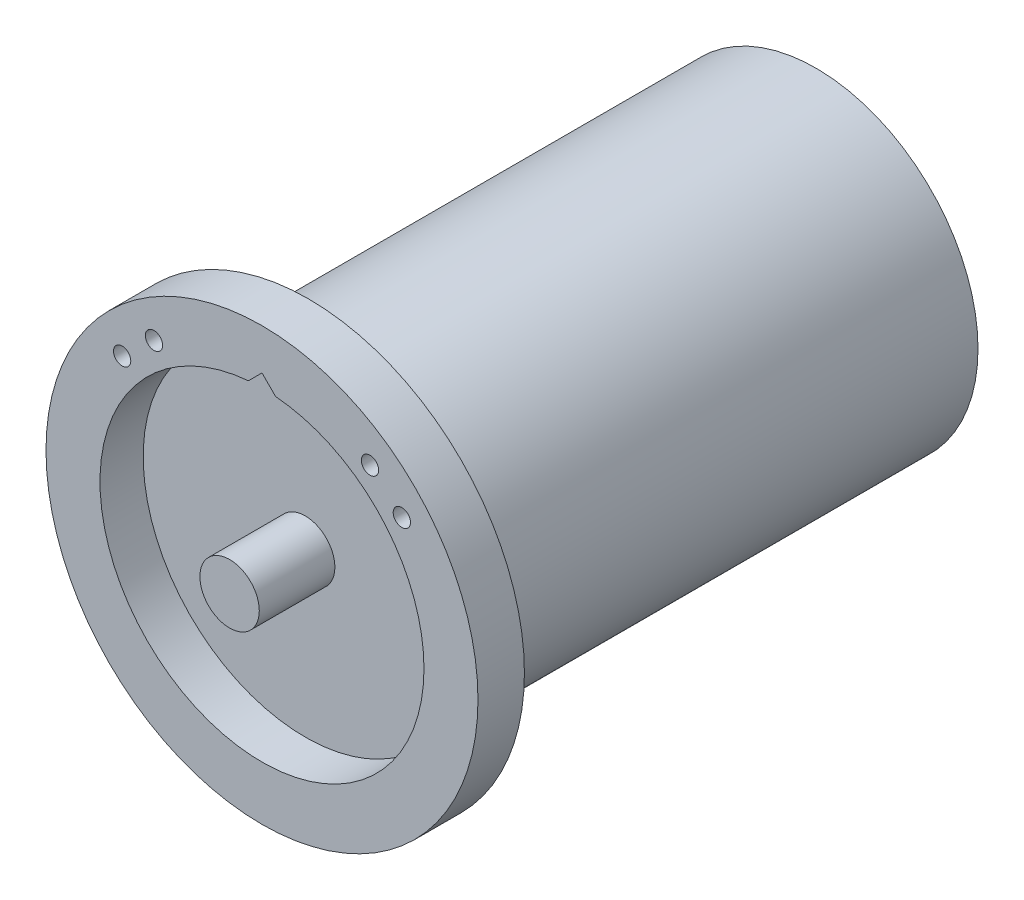
ISO-10303-21;
HEADER;
FILE_DESCRIPTION(('STEP AP214'),'2;1');
FILE_NAME('part.step','',(''),(''),'','','');
FILE_SCHEMA(('AUTOMOTIVE_DESIGN { 1 0 10303 214 1 1 1 1 }'));
ENDSEC;
DATA;
#1=APPLICATION_CONTEXT('core data for automotive mechanical design processes');
#2=APPLICATION_PROTOCOL_DEFINITION('international standard','automotive_design',2000,#1);
#3=PRODUCT_CONTEXT('',#1,'mechanical');
#4=PRODUCT('Part','Part','',(#3));
#5=PRODUCT_RELATED_PRODUCT_CATEGORY('part','',(#4));
#6=PRODUCT_DEFINITION_FORMATION('','',#4);
#7=PRODUCT_DEFINITION_CONTEXT('part definition',#1,'design');
#8=PRODUCT_DEFINITION('design','',#6,#7);
#9=PRODUCT_DEFINITION_SHAPE('','',#8);
#10=(LENGTH_UNIT() NAMED_UNIT(*) SI_UNIT(.MILLI.,.METRE.));
#11=(NAMED_UNIT(*) PLANE_ANGLE_UNIT() SI_UNIT($,.RADIAN.));
#12=(NAMED_UNIT(*) SI_UNIT($,.STERADIAN.) SOLID_ANGLE_UNIT());
#13=UNCERTAINTY_MEASURE_WITH_UNIT(LENGTH_MEASURE(1.E-05),#10,'distance_accuracy_value','');
#14=(GEOMETRIC_REPRESENTATION_CONTEXT(3) GLOBAL_UNCERTAINTY_ASSIGNED_CONTEXT((#13)) GLOBAL_UNIT_ASSIGNED_CONTEXT((#10,
#11,#12)) REPRESENTATION_CONTEXT('',''));
#15=CARTESIAN_POINT('',(0.,0.,0.));
#16=DIRECTION('',(0.,0.,1.));
#17=DIRECTION('',(1.,0.,0.));
#18=AXIS2_PLACEMENT_3D('',#15,#16,#17);
#19=CARTESIAN_POINT('',(0.,0.,2.));
#20=DIRECTION('',(0.,0.,-1.));
#21=DIRECTION('',(-1.,0.,0.));
#22=AXIS2_PLACEMENT_3D('',#19,#20,#21);
#23=CYLINDRICAL_SURFACE('',#22,15.5);
#24=CARTESIAN_POINT('',(0.,0.,2.));
#25=DIRECTION('',(0.,0.,1.));
#26=DIRECTION('',(1.,0.,0.));
#27=AXIS2_PLACEMENT_3D('',#24,#25,#26);
#28=CIRCLE('',#27,15.5);
#29=CARTESIAN_POINT('',(15.5,0.,2.));
#30=VERTEX_POINT('',#29);
#31=EDGE_CURVE('E131',#30,#30,#28,.T.);
#32=ORIENTED_EDGE('',*,*,#31,.F.);
#33=EDGE_LOOP('',(#32));
#34=FACE_BOUND('',#33,.T.);
#35=CARTESIAN_POINT('',(0.,0.,0.));
#36=DIRECTION('',(0.,0.,1.));
#37=DIRECTION('',(1.,0.,0.));
#38=AXIS2_PLACEMENT_3D('',#35,#36,#37);
#39=CIRCLE('',#38,15.5);
#40=CARTESIAN_POINT('',(15.5,0.,0.));
#41=VERTEX_POINT('',#40);
#42=EDGE_CURVE('E127',#41,#41,#39,.T.);
#43=ORIENTED_EDGE('',*,*,#42,.T.);
#44=EDGE_LOOP('',(#43));
#45=FACE_BOUND('',#44,.T.);
#46=ADVANCED_FACE('F40',(#34,#45),#23,.T.);
#47=CARTESIAN_POINT('',(0.,0.,0.));
#48=DIRECTION('',(0.,0.,1.));
#49=DIRECTION('',(1.,0.,0.));
#50=AXIS2_PLACEMENT_3D('',#47,#48,#49);
#51=PLANE('',#50);
#52=CARTESIAN_POINT('',(0.,0.,0.));
#53=DIRECTION('',(0.,0.,-1.));
#54=DIRECTION('',(-1.,0.,0.));
#55=AXIS2_PLACEMENT_3D('',#52,#53,#54);
#56=CIRCLE('',#55,15.);
#57=CARTESIAN_POINT('',(15.,0.,0.));
#58=VERTEX_POINT('',#57);
#59=EDGE_CURVE('E128',#58,#58,#56,.T.);
#60=ORIENTED_EDGE('',*,*,#59,.F.);
#61=EDGE_LOOP('',(#60));
#62=FACE_BOUND('',#61,.T.);
#63=ORIENTED_EDGE('',*,*,#42,.F.);
#64=EDGE_LOOP('',(#63));
#65=FACE_BOUND('',#64,.T.);
#66=ADVANCED_FACE('F183',(#62,#65),#51,.F.);
#67=CARTESIAN_POINT('',(0.,0.,-45.));
#68=DIRECTION('',(0.,0.,1.));
#69=DIRECTION('',(1.,0.,0.));
#70=AXIS2_PLACEMENT_3D('',#67,#68,#69);
#71=CYLINDRICAL_SURFACE('',#70,15.);
#72=CARTESIAN_POINT('',(0.,0.,-45.));
#73=DIRECTION('',(0.,0.,-1.));
#74=DIRECTION('',(-1.,0.,0.));
#75=AXIS2_PLACEMENT_3D('',#72,#73,#74);
#76=CIRCLE('',#75,15.);
#77=CARTESIAN_POINT('',(15.,0.,-45.));
#78=VERTEX_POINT('',#77);
#79=EDGE_CURVE('E122',#78,#78,#76,.T.);
#80=CARTESIAN_POINT('',(15.,0.,-45.));
#81=CARTESIAN_POINT('',(15.,0.,-44.53125));
#82=CARTESIAN_POINT('',(15.,0.,-44.0625));
#83=CARTESIAN_POINT('',(15.,0.,-43.125));
#84=CARTESIAN_POINT('',(15.,0.,-42.65625));
#85=CARTESIAN_POINT('',(15.,0.,-41.71875));
#86=CARTESIAN_POINT('',(15.,0.,-41.25));
#87=CARTESIAN_POINT('',(15.,0.,-40.3125));
#88=CARTESIAN_POINT('',(15.,0.,-39.84375));
#89=CARTESIAN_POINT('',(15.,0.,-38.90625));
#90=CARTESIAN_POINT('',(15.,0.,-38.4375));
#91=CARTESIAN_POINT('',(15.,0.,-37.5));
#92=CARTESIAN_POINT('',(15.,0.,-37.03125));
#93=CARTESIAN_POINT('',(15.,0.,-36.09375));
#94=CARTESIAN_POINT('',(15.,0.,-35.625));
#95=CARTESIAN_POINT('',(15.,0.,-34.6875));
#96=CARTESIAN_POINT('',(15.,0.,-34.21875));
#97=CARTESIAN_POINT('',(15.,0.,-33.28125));
#98=CARTESIAN_POINT('',(15.,0.,-32.8125));
#99=CARTESIAN_POINT('',(15.,0.,-31.875));
#100=CARTESIAN_POINT('',(15.,0.,-31.40625));
#101=CARTESIAN_POINT('',(15.,0.,-30.46875));
#102=CARTESIAN_POINT('',(15.,0.,-30.));
#103=CARTESIAN_POINT('',(15.,0.,-29.0625));
#104=CARTESIAN_POINT('',(15.,0.,-28.59375));
#105=CARTESIAN_POINT('',(15.,0.,-27.65625));
#106=CARTESIAN_POINT('',(15.,0.,-27.1875));
#107=CARTESIAN_POINT('',(15.,0.,-26.25));
#108=CARTESIAN_POINT('',(15.,0.,-25.78125));
#109=CARTESIAN_POINT('',(15.,0.,-24.84375));
#110=CARTESIAN_POINT('',(15.,0.,-24.375));
#111=CARTESIAN_POINT('',(15.,0.,-23.4375));
#112=CARTESIAN_POINT('',(15.,0.,-22.96875));
#113=CARTESIAN_POINT('',(15.,0.,-22.03125));
#114=CARTESIAN_POINT('',(15.,0.,-21.5625));
#115=CARTESIAN_POINT('',(15.,0.,-20.625));
#116=CARTESIAN_POINT('',(15.,0.,-20.15625));
#117=CARTESIAN_POINT('',(15.,0.,-19.21875));
#118=CARTESIAN_POINT('',(15.,0.,-18.75));
#119=CARTESIAN_POINT('',(15.,0.,-17.8125));
#120=CARTESIAN_POINT('',(15.,0.,-17.34375));
#121=CARTESIAN_POINT('',(15.,0.,-16.40625));
#122=CARTESIAN_POINT('',(15.,0.,-15.9375));
#123=CARTESIAN_POINT('',(15.,0.,-15.));
#124=CARTESIAN_POINT('',(15.,0.,-14.53125));
#125=CARTESIAN_POINT('',(15.,0.,-13.59375));
#126=CARTESIAN_POINT('',(15.,0.,-13.125));
#127=CARTESIAN_POINT('',(15.,0.,-12.1875));
#128=CARTESIAN_POINT('',(15.,0.,-11.71875));
#129=CARTESIAN_POINT('',(15.,0.,-10.78125));
#130=CARTESIAN_POINT('',(15.,0.,-10.3125));
#131=CARTESIAN_POINT('',(15.,0.,-9.37499999999999));
#132=CARTESIAN_POINT('',(15.,0.,-8.90624999999999));
#133=CARTESIAN_POINT('',(15.,0.,-7.96874999999999));
#134=CARTESIAN_POINT('',(15.,0.,-7.5));
#135=CARTESIAN_POINT('',(15.,0.,-6.56249999999999));
#136=CARTESIAN_POINT('',(15.,0.,-6.09374999999999));
#137=CARTESIAN_POINT('',(15.,0.,-5.15624999999999));
#138=CARTESIAN_POINT('',(15.,0.,-4.68749999999999));
#139=CARTESIAN_POINT('',(15.,0.,-3.74999999999999));
#140=CARTESIAN_POINT('',(15.,0.,-3.28124999999999));
#141=CARTESIAN_POINT('',(15.,0.,-2.34374999999999));
#142=CARTESIAN_POINT('',(15.,0.,-1.87499999999999));
#143=CARTESIAN_POINT('',(15.,0.,-0.937499999999992));
#144=CARTESIAN_POINT('',(15.,0.,-0.468749999999993));
#145=CARTESIAN_POINT('',(15.,0.,0.));
#146=B_SPLINE_CURVE_WITH_KNOTS('',3,(#80,#81,#82,#83,#84,#85,#86,#87,#88,#89,#90,#91,#92,#93,
#94,#95,#96,#97,#98,#99,#100,#101,#102,#103,#104,#105,#106,#107,#108,#109,#110,#111,#112,#113,
#114,#115,#116,#117,#118,#119,#120,#121,#122,#123,#124,#125,#126,#127,#128,#129,#130,#131,#132,
#133,#134,#135,#136,#137,#138,#139,#140,#141,#142,#143,#144,#145),.UNSPECIFIED.,.F.,.F.,(4,2,2,
2,2,2,2,2,2,2,2,2,2,2,2,2,2,2,2,2,2,2,2,2,2,2,2,2,2,2,2,2,4),(0.,1.40625,2.8125,
4.21874999999999,5.625,7.03125,8.43749999999999,9.84375,11.25,12.65625,14.0625,15.46875,16.875,
18.28125,19.6875,21.09375,22.5,23.90625,25.3125,26.71875,28.125,29.53125,30.9375,32.34375,33.75,
35.15625,36.5625,37.96875,39.375,40.78125,42.1875,43.59375,45.),.UNSPECIFIED.);
#147=EDGE_CURVE('BSEAM188',#78,#58,#146,.T.);
#148=ORIENTED_EDGE('',*,*,#79,.F.);
#149=ORIENTED_EDGE('',*,*,#59,.T.);
#150=ORIENTED_EDGE('',*,*,#147,.T.);
#151=ORIENTED_EDGE('',*,*,#147,.F.);
#152=EDGE_LOOP('',(#148,#150,#149,#151));
#153=FACE_BOUND('',#152,.T.);
#154=ADVANCED_FACE('F188',(#153),#71,.T.);
#155=CARTESIAN_POINT('',(0.,0.,-45.));
#156=DIRECTION('',(0.,0.,-1.));
#157=DIRECTION('',(-1.,0.,0.));
#158=AXIS2_PLACEMENT_3D('',#155,#156,#157);
#159=PLANE('',#158);
#160=CARTESIAN_POINT('',(0.,13.,-45.));
#161=DIRECTION('',(0.,0.,-1.));
#162=DIRECTION('',(-1.,0.,0.));
#163=AXIS2_PLACEMENT_3D('',#160,#161,#162);
#164=CIRCLE('',#163,1.6);
#165=CARTESIAN_POINT('',(-1.6,13.,-45.));
#166=VERTEX_POINT('',#165);
#167=EDGE_CURVE('E211',#166,#166,#164,.T.);
#168=ORIENTED_EDGE('',*,*,#167,.F.);
#169=EDGE_LOOP('',(#168));
#170=FACE_BOUND('',#169,.T.);
#171=CARTESIAN_POINT('',(11.2583302491962,6.50000000000252,-45.));
#172=DIRECTION('',(0.,0.,-1.));
#173=DIRECTION('',(-1.,0.,0.));
#174=AXIS2_PLACEMENT_3D('',#171,#172,#173);
#175=CIRCLE('',#174,1.6);
#176=CARTESIAN_POINT('',(9.65833024919625,6.50000000000252,-45.));
#177=VERTEX_POINT('',#176);
#178=EDGE_CURVE('E215',#177,#177,#175,.T.);
#179=ORIENTED_EDGE('',*,*,#178,.F.);
#180=EDGE_LOOP('',(#179));
#181=FACE_BOUND('',#180,.T.);
#182=CARTESIAN_POINT('',(11.2583302491989,-6.49999999999799,-45.));
#183=DIRECTION('',(0.,0.,-1.));
#184=DIRECTION('',(-1.,0.,0.));
#185=AXIS2_PLACEMENT_3D('',#182,#183,#184);
#186=CIRCLE('',#185,1.6);
#187=CARTESIAN_POINT('',(9.65833024919886,-6.49999999999799,-45.));
#188=VERTEX_POINT('',#187);
#189=EDGE_CURVE('E219',#188,#188,#186,.T.);
#190=ORIENTED_EDGE('',*,*,#189,.F.);
#191=EDGE_LOOP('',(#190));
#192=FACE_BOUND('',#191,.T.);
#193=CARTESIAN_POINT('',(1.74166236988071E-12,-13.,-45.));
#194=DIRECTION('',(0.,0.,-1.));
#195=DIRECTION('',(-1.,0.,0.));
#196=AXIS2_PLACEMENT_3D('',#193,#194,#195);
#197=CIRCLE('',#196,1.6);
#198=CARTESIAN_POINT('',(-1.59999999999826,-13.,-45.));
#199=VERTEX_POINT('',#198);
#200=EDGE_CURVE('E223',#199,#199,#197,.T.);
#201=ORIENTED_EDGE('',*,*,#200,.F.);
#202=EDGE_LOOP('',(#201));
#203=FACE_BOUND('',#202,.T.);
#204=CARTESIAN_POINT('',(-11.2583302491971,-6.50000000000101,-45.));
#205=DIRECTION('',(0.,0.,-1.));
#206=DIRECTION('',(-1.,0.,0.));
#207=AXIS2_PLACEMENT_3D('',#204,#205,#206);
#208=CIRCLE('',#207,1.6);
#209=CARTESIAN_POINT('',(-12.8583302491971,-6.50000000000101,-45.));
#210=VERTEX_POINT('',#209);
#211=EDGE_CURVE('E227',#210,#210,#208,.T.);
#212=ORIENTED_EDGE('',*,*,#211,.F.);
#213=EDGE_LOOP('',(#212));
#214=FACE_BOUND('',#213,.T.);
#215=CARTESIAN_POINT('',(-11.258330249198,6.4999999999995,-45.));
#216=DIRECTION('',(0.,0.,-1.));
#217=DIRECTION('',(-1.,0.,0.));
#218=AXIS2_PLACEMENT_3D('',#215,#216,#217);
#219=CIRCLE('',#218,1.6);
#220=CARTESIAN_POINT('',(-12.858330249198,6.4999999999995,-45.));
#221=VERTEX_POINT('',#220);
#222=EDGE_CURVE('E231',#221,#221,#219,.T.);
#223=ORIENTED_EDGE('',*,*,#222,.F.);
#224=EDGE_LOOP('',(#223));
#225=FACE_BOUND('',#224,.T.);
#226=ORIENTED_EDGE('',*,*,#79,.T.);
#227=EDGE_LOOP('',(#226));
#228=FACE_BOUND('',#227,.T.);
#229=ADVANCED_FACE('F168',(#170,#181,#192,#203,#214,#225,#228),#159,.T.);
#230=CARTESIAN_POINT('',(0.,0.,6.3));
#231=DIRECTION('',(0.,0.,-1.));
#232=DIRECTION('',(-1.,0.,0.));
#233=AXIS2_PLACEMENT_3D('',#230,#231,#232);
#234=CYLINDRICAL_SURFACE('',#233,20.);
#235=CARTESIAN_POINT('',(0.,0.,6.3));
#236=DIRECTION('',(0.,0.,1.));
#237=DIRECTION('',(1.,0.,0.));
#238=AXIS2_PLACEMENT_3D('',#235,#236,#237);
#239=CIRCLE('',#238,20.);
#240=CARTESIAN_POINT('',(-20.,0.,6.3));
#241=VERTEX_POINT('',#240);
#242=EDGE_CURVE('E119',#241,#241,#239,.T.);
#243=CARTESIAN_POINT('',(0.,0.,2.));
#244=DIRECTION('',(0.,0.,1.));
#245=DIRECTION('',(1.,0.,0.));
#246=AXIS2_PLACEMENT_3D('',#243,#244,#245);
#247=CIRCLE('',#246,20.);
#248=CARTESIAN_POINT('',(-20.,0.,2.));
#249=VERTEX_POINT('',#248);
#250=EDGE_CURVE('E116',#249,#249,#247,.T.);
#251=CARTESIAN_POINT('',(-20.,0.,6.3));
#252=CARTESIAN_POINT('',(-20.,0.,6.25520833333333));
#253=CARTESIAN_POINT('',(-20.,0.,6.21041666666667));
#254=CARTESIAN_POINT('',(-20.,0.,6.12083333333333));
#255=CARTESIAN_POINT('',(-20.,0.,6.07604166666667));
#256=CARTESIAN_POINT('',(-20.,0.,5.98645833333333));
#257=CARTESIAN_POINT('',(-20.,0.,5.94166666666667));
#258=CARTESIAN_POINT('',(-20.,0.,5.85208333333333));
#259=CARTESIAN_POINT('',(-20.,0.,5.80729166666667));
#260=CARTESIAN_POINT('',(-20.,0.,5.71770833333333));
#261=CARTESIAN_POINT('',(-20.,0.,5.67291666666667));
#262=CARTESIAN_POINT('',(-20.,0.,5.58333333333333));
#263=CARTESIAN_POINT('',(-20.,0.,5.53854166666667));
#264=CARTESIAN_POINT('',(-20.,0.,5.44895833333333));
#265=CARTESIAN_POINT('',(-20.,0.,5.40416666666667));
#266=CARTESIAN_POINT('',(-20.,0.,5.31458333333333));
#267=CARTESIAN_POINT('',(-20.,0.,5.26979166666667));
#268=CARTESIAN_POINT('',(-20.,0.,5.18020833333333));
#269=CARTESIAN_POINT('',(-20.,0.,5.13541666666667));
#270=CARTESIAN_POINT('',(-20.,0.,5.04583333333333));
#271=CARTESIAN_POINT('',(-20.,0.,5.00104166666667));
#272=CARTESIAN_POINT('',(-20.,0.,4.91145833333333));
#273=CARTESIAN_POINT('',(-20.,0.,4.86666666666667));
#274=CARTESIAN_POINT('',(-20.,0.,4.77708333333333));
#275=CARTESIAN_POINT('',(-20.,0.,4.73229166666667));
#276=CARTESIAN_POINT('',(-20.,0.,4.64270833333333));
#277=CARTESIAN_POINT('',(-20.,0.,4.59791666666667));
#278=CARTESIAN_POINT('',(-20.,0.,4.50833333333333));
#279=CARTESIAN_POINT('',(-20.,0.,4.46354166666667));
#280=CARTESIAN_POINT('',(-20.,0.,4.37395833333333));
#281=CARTESIAN_POINT('',(-20.,0.,4.32916666666667));
#282=CARTESIAN_POINT('',(-20.,0.,4.23958333333333));
#283=CARTESIAN_POINT('',(-20.,0.,4.19479166666667));
#284=CARTESIAN_POINT('',(-20.,0.,4.10520833333333));
#285=CARTESIAN_POINT('',(-20.,0.,4.06041666666667));
#286=CARTESIAN_POINT('',(-20.,0.,3.97083333333333));
#287=CARTESIAN_POINT('',(-20.,0.,3.92604166666667));
#288=CARTESIAN_POINT('',(-20.,0.,3.83645833333333));
#289=CARTESIAN_POINT('',(-20.,0.,3.79166666666667));
#290=CARTESIAN_POINT('',(-20.,0.,3.70208333333333));
#291=CARTESIAN_POINT('',(-20.,0.,3.65729166666667));
#292=CARTESIAN_POINT('',(-20.,0.,3.56770833333333));
#293=CARTESIAN_POINT('',(-20.,0.,3.52291666666667));
#294=CARTESIAN_POINT('',(-20.,0.,3.43333333333333));
#295=CARTESIAN_POINT('',(-20.,0.,3.38854166666667));
#296=CARTESIAN_POINT('',(-20.,0.,3.29895833333333));
#297=CARTESIAN_POINT('',(-20.,0.,3.25416666666667));
#298=CARTESIAN_POINT('',(-20.,0.,3.16458333333333));
#299=CARTESIAN_POINT('',(-20.,0.,3.11979166666667));
#300=CARTESIAN_POINT('',(-20.,0.,3.03020833333333));
#301=CARTESIAN_POINT('',(-20.,0.,2.98541666666667));
#302=CARTESIAN_POINT('',(-20.,0.,2.89583333333333));
#303=CARTESIAN_POINT('',(-20.,0.,2.85104166666667));
#304=CARTESIAN_POINT('',(-20.,0.,2.76145833333333));
#305=CARTESIAN_POINT('',(-20.,0.,2.71666666666667));
#306=CARTESIAN_POINT('',(-20.,0.,2.62708333333333));
#307=CARTESIAN_POINT('',(-20.,0.,2.58229166666667));
#308=CARTESIAN_POINT('',(-20.,0.,2.49270833333333));
#309=CARTESIAN_POINT('',(-20.,0.,2.44791666666667));
#310=CARTESIAN_POINT('',(-20.,0.,2.35833333333333));
#311=CARTESIAN_POINT('',(-20.,0.,2.31354166666667));
#312=CARTESIAN_POINT('',(-20.,0.,2.22395833333333));
#313=CARTESIAN_POINT('',(-20.,0.,2.17916666666667));
#314=CARTESIAN_POINT('',(-20.,0.,2.08958333333333));
#315=CARTESIAN_POINT('',(-20.,0.,2.04479166666667));
#316=CARTESIAN_POINT('',(-20.,0.,2.));
#317=B_SPLINE_CURVE_WITH_KNOTS('',3,(#251,#252,#253,#254,#255,#256,#257,#258,#259,#260,#261,
#262,#263,#264,#265,#266,#267,#268,#269,#270,#271,#272,#273,#274,#275,#276,#277,#278,#279,#280,
#281,#282,#283,#284,#285,#286,#287,#288,#289,#290,#291,#292,#293,#294,#295,#296,#297,#298,#299,
#300,#301,#302,#303,#304,#305,#306,#307,#308,#309,#310,#311,#312,#313,#314,#315,#316),
.UNSPECIFIED.,.F.,.F.,(4,2,2,2,2,2,2,2,2,2,2,2,2,2,2,2,2,2,2,2,2,2,2,2,2,2,2,2,2,2,2,2,4),(0.,
0.134375000000001,0.268750000000001,0.403125000000001,0.537500000000001,0.671875000000001,
0.806250000000001,0.940625,1.075,1.209375,1.34375,1.478125,1.6125,1.746875,1.88125,2.015625,
2.15,2.284375,2.41875,2.553125,2.6875,2.821875,2.95625,3.090625,3.225,3.359375,3.49375,3.628125,
3.7625,3.896875,4.03125,4.165625,4.3),.UNSPECIFIED.);
#318=EDGE_CURVE('BSEAM154',#241,#249,#317,.T.);
#319=ORIENTED_EDGE('',*,*,#242,.F.);
#320=ORIENTED_EDGE('',*,*,#250,.T.);
#321=ORIENTED_EDGE('',*,*,#318,.T.);
#322=ORIENTED_EDGE('',*,*,#318,.F.);
#323=EDGE_LOOP('',(#319,#321,#320,#322));
#324=FACE_BOUND('',#323,.T.);
#325=ADVANCED_FACE('F154',(#324),#234,.T.);
#326=CARTESIAN_POINT('',(0.,0.,6.3));
#327=DIRECTION('',(0.,0.,1.));
#328=DIRECTION('',(1.,0.,0.));
#329=AXIS2_PLACEMENT_3D('',#326,#327,#328);
#330=PLANE('',#329);
#331=DIRECTION('',(-0.707106781186548,-0.707106781186547,0.));
#332=VECTOR('',#331,1.);
#333=CARTESIAN_POINT('',(-2.82842712474619,13.378,6.3));
#334=LINE('',#333,#332);
#335=CARTESIAN_POINT('',(0.,16.2064271247462,6.3));
#336=VERTEX_POINT('',#335);
#337=CARTESIAN_POINT('',(-1.25938934176568,14.9470377829805,6.3));
#338=VERTEX_POINT('',#337);
#339=EDGE_CURVE('E75',#336,#338,#334,.T.);
#340=ORIENTED_EDGE('',*,*,#339,.F.);
#341=DIRECTION('',(-0.707106781186547,0.707106781186548,0.));
#342=VECTOR('',#341,1.);
#343=CARTESIAN_POINT('',(0.,16.2064271247462,6.3));
#344=LINE('',#343,#342);
#345=CARTESIAN_POINT('',(1.25938934176568,14.9470377829805,6.3));
#346=VERTEX_POINT('',#345);
#347=EDGE_CURVE('E81',#346,#336,#344,.T.);
#348=ORIENTED_EDGE('',*,*,#347,.F.);
#349=CARTESIAN_POINT('',(0.,0.,6.3));
#350=DIRECTION('',(0.,0.,1.));
#351=DIRECTION('',(1.,0.,0.));
#352=AXIS2_PLACEMENT_3D('',#349,#350,#351);
#353=CIRCLE('',#352,15.);
#354=EDGE_CURVE('E108',#338,#346,#353,.T.);
#355=ORIENTED_EDGE('',*,*,#354,.F.);
#356=EDGE_LOOP('',(#340,#348,#355));
#357=FACE_BOUND('',#356,.T.);
#358=CARTESIAN_POINT('',(12.95,11.0905365064094,6.3));
#359=DIRECTION('',(0.,0.,1.));
#360=DIRECTION('',(-1.,0.,0.));
#361=AXIS2_PLACEMENT_3D('',#358,#359,#360);
#362=CIRCLE('',#361,0.799999999999999);
#363=CARTESIAN_POINT('',(12.15,11.0905365064094,6.3));
#364=VERTEX_POINT('',#363);
#365=EDGE_CURVE('E84',#364,#364,#362,.T.);
#366=ORIENTED_EDGE('',*,*,#365,.F.);
#367=EDGE_LOOP('',(#366));
#368=FACE_BOUND('',#367,.T.);
#369=CARTESIAN_POINT('',(-12.95,11.0905365064094,6.3));
#370=DIRECTION('',(0.,0.,1.));
#371=DIRECTION('',(1.,0.,0.));
#372=AXIS2_PLACEMENT_3D('',#369,#370,#371);
#373=CIRCLE('',#372,0.799999999999999);
#374=CARTESIAN_POINT('',(-12.15,11.0905365064094,6.3));
#375=VERTEX_POINT('',#374);
#376=EDGE_CURVE('E97',#375,#375,#373,.T.);
#377=ORIENTED_EDGE('',*,*,#376,.F.);
#378=EDGE_LOOP('',(#377));
#379=FACE_BOUND('',#378,.T.);
#380=CARTESIAN_POINT('',(10.,13.8095075944076,6.3));
#381=DIRECTION('',(0.,0.,1.));
#382=DIRECTION('',(-1.,0.,0.));
#383=AXIS2_PLACEMENT_3D('',#380,#381,#382);
#384=CIRCLE('',#383,0.800000000000004);
#385=CARTESIAN_POINT('',(9.2,13.8095075944076,6.3));
#386=VERTEX_POINT('',#385);
#387=EDGE_CURVE('E93',#386,#386,#384,.T.);
#388=ORIENTED_EDGE('',*,*,#387,.F.);
#389=EDGE_LOOP('',(#388));
#390=FACE_BOUND('',#389,.T.);
#391=CARTESIAN_POINT('',(-10.,13.8095075944076,6.3));
#392=DIRECTION('',(0.,0.,1.));
#393=DIRECTION('',(1.,0.,0.));
#394=AXIS2_PLACEMENT_3D('',#391,#392,#393);
#395=CIRCLE('',#394,0.800000000000001);
#396=CARTESIAN_POINT('',(-9.2,13.8095075944076,6.3));
#397=VERTEX_POINT('',#396);
#398=EDGE_CURVE('E96',#397,#397,#395,.T.);
#399=ORIENTED_EDGE('',*,*,#398,.F.);
#400=EDGE_LOOP('',(#399));
#401=FACE_BOUND('',#400,.T.);
#402=ORIENTED_EDGE('',*,*,#242,.T.);
#403=EDGE_LOOP('',(#402));
#404=FACE_BOUND('',#403,.T.);
#405=ADVANCED_FACE('F150',(#357,#368,#379,#390,#401,#404),#330,.T.);
#406=CARTESIAN_POINT('',(0.,0.,2.));
#407=DIRECTION('',(0.,0.,1.));
#408=DIRECTION('',(1.,0.,0.));
#409=AXIS2_PLACEMENT_3D('',#406,#407,#408);
#410=PLANE('',#409);
#411=CARTESIAN_POINT('',(12.95,11.0905365064094,2.));
#412=DIRECTION('',(0.,0.,1.));
#413=DIRECTION('',(1.,0.,0.));
#414=AXIS2_PLACEMENT_3D('',#411,#412,#413);
#415=CIRCLE('',#414,0.799999999999999);
#416=CARTESIAN_POINT('',(13.75,11.0905365064094,2.));
#417=VERTEX_POINT('',#416);
#418=EDGE_CURVE('E112',#417,#417,#415,.T.);
#419=ORIENTED_EDGE('',*,*,#418,.T.);
#420=EDGE_LOOP('',(#419));
#421=FACE_BOUND('',#420,.T.);
#422=CARTESIAN_POINT('',(-12.95,11.0905365064094,2.));
#423=DIRECTION('',(0.,0.,1.));
#424=DIRECTION('',(1.,0.,0.));
#425=AXIS2_PLACEMENT_3D('',#422,#423,#424);
#426=CIRCLE('',#425,0.799999999999999);
#427=CARTESIAN_POINT('',(-12.15,11.0905365064094,2.));
#428=VERTEX_POINT('',#427);
#429=EDGE_CURVE('E141',#428,#428,#426,.T.);
#430=ORIENTED_EDGE('',*,*,#429,.T.);
#431=EDGE_LOOP('',(#430));
#432=FACE_BOUND('',#431,.T.);
#433=CARTESIAN_POINT('',(10.,13.8095075944076,2.));
#434=DIRECTION('',(0.,0.,1.));
#435=DIRECTION('',(1.,0.,0.));
#436=AXIS2_PLACEMENT_3D('',#433,#434,#435);
#437=CIRCLE('',#436,0.800000000000004);
#438=CARTESIAN_POINT('',(10.8,13.8095075944076,2.));
#439=VERTEX_POINT('',#438);
#440=EDGE_CURVE('E138',#439,#439,#437,.T.);
#441=ORIENTED_EDGE('',*,*,#440,.T.);
#442=EDGE_LOOP('',(#441));
#443=FACE_BOUND('',#442,.T.);
#444=CARTESIAN_POINT('',(-10.,13.8095075944076,2.));
#445=DIRECTION('',(0.,0.,1.));
#446=DIRECTION('',(1.,0.,0.));
#447=AXIS2_PLACEMENT_3D('',#444,#445,#446);
#448=CIRCLE('',#447,0.800000000000001);
#449=CARTESIAN_POINT('',(-9.2,13.8095075944076,2.));
#450=VERTEX_POINT('',#449);
#451=EDGE_CURVE('E104',#450,#450,#448,.T.);
#452=ORIENTED_EDGE('',*,*,#451,.T.);
#453=EDGE_LOOP('',(#452));
#454=FACE_BOUND('',#453,.T.);
#455=ORIENTED_EDGE('',*,*,#31,.T.);
#456=EDGE_LOOP('',(#455));
#457=FACE_BOUND('',#456,.T.);
#458=ORIENTED_EDGE('',*,*,#250,.F.);
#459=EDGE_LOOP('',(#458));
#460=FACE_BOUND('',#459,.T.);
#461=ADVANCED_FACE('F153',(#421,#432,#443,#454,#457,#460),#410,.F.);
#462=CARTESIAN_POINT('',(0.,0.,2.3));
#463=DIRECTION('',(0.,0.,1.));
#464=DIRECTION('',(1.,0.,0.));
#465=AXIS2_PLACEMENT_3D('',#462,#463,#464);
#466=CYLINDRICAL_SURFACE('',#465,15.);
#467=CARTESIAN_POINT('',(0.,0.,2.3));
#468=DIRECTION('',(0.,0.,1.));
#469=DIRECTION('',(1.,0.,0.));
#470=AXIS2_PLACEMENT_3D('',#467,#468,#469);
#471=CIRCLE('',#470,15.);
#472=CARTESIAN_POINT('',(15.,0.,2.3));
#473=VERTEX_POINT('',#472);
#474=EDGE_CURVE('E113',#473,#473,#471,.T.);
#475=ORIENTED_EDGE('',*,*,#474,.F.);
#476=EDGE_LOOP('',(#475));
#477=FACE_BOUND('',#476,.T.);
#478=CARTESIAN_POINT('',(0.,0.,4.3));
#479=DIRECTION('',(0.,0.,1.));
#480=DIRECTION('',(1.,0.,0.));
#481=AXIS2_PLACEMENT_3D('',#478,#479,#480);
#482=CIRCLE('',#481,15.);
#483=CARTESIAN_POINT('',(-1.25938934176568,14.9470377829805,4.3));
#484=VERTEX_POINT('',#483);
#485=CARTESIAN_POINT('',(1.25938934176568,14.9470377829805,4.3));
#486=VERTEX_POINT('',#485);
#487=EDGE_CURVE('E58',#484,#486,#482,.F.);
#488=ORIENTED_EDGE('',*,*,#487,.F.);
#489=DIRECTION('',(0.,0.,1.));
#490=VECTOR('',#489,1.);
#491=CARTESIAN_POINT('',(-1.25938934176568,14.9470377829805,2.3));
#492=LINE('',#491,#490);
#493=EDGE_CURVE('E11',#484,#338,#492,.T.);
#494=ORIENTED_EDGE('',*,*,#493,.T.);
#495=ORIENTED_EDGE('',*,*,#354,.T.);
#496=DIRECTION('',(0.,0.,1.));
#497=VECTOR('',#496,1.);
#498=CARTESIAN_POINT('',(1.25938934176568,14.9470377829805,2.3));
#499=LINE('',#498,#497);
#500=EDGE_CURVE('E47',#346,#486,#499,.F.);
#501=ORIENTED_EDGE('',*,*,#500,.T.);
#502=EDGE_LOOP('',(#488,#494,#495,#501));
#503=FACE_BOUND('',#502,.T.);
#504=ADVANCED_FACE('F147',(#477,#503),#466,.F.);
#505=CARTESIAN_POINT('',(0.,0.,2.3));
#506=DIRECTION('',(0.,0.,1.));
#507=DIRECTION('',(1.,0.,0.));
#508=AXIS2_PLACEMENT_3D('',#505,#506,#507);
#509=PLANE('',#508);
#510=CARTESIAN_POINT('',(0.,0.,2.3));
#511=DIRECTION('',(0.,0.,1.));
#512=DIRECTION('',(1.,0.,0.));
#513=AXIS2_PLACEMENT_3D('',#510,#511,#512);
#514=CIRCLE('',#513,2.75);
#515=CARTESIAN_POINT('',(2.75,0.,2.3));
#516=VERTEX_POINT('',#515);
#517=EDGE_CURVE('E109',#516,#516,#514,.T.);
#518=ORIENTED_EDGE('',*,*,#517,.F.);
#519=EDGE_LOOP('',(#518));
#520=FACE_BOUND('',#519,.T.);
#521=ORIENTED_EDGE('',*,*,#474,.T.);
#522=EDGE_LOOP('',(#521));
#523=FACE_BOUND('',#522,.T.);
#524=ADVANCED_FACE('F178',(#520,#523),#509,.T.);
#525=CARTESIAN_POINT('',(0.,0.,9.3));
#526=DIRECTION('',(0.,0.,-1.));
#527=DIRECTION('',(-1.,0.,0.));
#528=AXIS2_PLACEMENT_3D('',#525,#526,#527);
#529=CYLINDRICAL_SURFACE('',#528,2.75);
#530=CARTESIAN_POINT('',(0.,0.,9.3));
#531=DIRECTION('',(0.,0.,1.));
#532=DIRECTION('',(1.,0.,0.));
#533=AXIS2_PLACEMENT_3D('',#530,#531,#532);
#534=CIRCLE('',#533,2.75);
#535=CARTESIAN_POINT('',(2.75,0.,9.3));
#536=VERTEX_POINT('',#535);
#537=EDGE_CURVE('E105',#536,#536,#534,.T.);
#538=ORIENTED_EDGE('',*,*,#537,.F.);
#539=EDGE_LOOP('',(#538));
#540=FACE_BOUND('',#539,.T.);
#541=ORIENTED_EDGE('',*,*,#517,.T.);
#542=EDGE_LOOP('',(#541));
#543=FACE_BOUND('',#542,.T.);
#544=ADVANCED_FACE('F337',(#540,#543),#529,.T.);
#545=CARTESIAN_POINT('',(0.,0.,9.3));
#546=DIRECTION('',(0.,0.,1.));
#547=DIRECTION('',(1.,0.,0.));
#548=AXIS2_PLACEMENT_3D('',#545,#546,#547);
#549=PLANE('',#548);
#550=ORIENTED_EDGE('',*,*,#537,.T.);
#551=EDGE_LOOP('',(#550));
#552=FACE_BOUND('',#551,.T.);
#553=ADVANCED_FACE('F333',(#552),#549,.T.);
#554=CARTESIAN_POINT('',(-10.,13.8095075944076,-0.7));
#555=DIRECTION('',(0.,0.,1.));
#556=DIRECTION('',(1.,0.,0.));
#557=AXIS2_PLACEMENT_3D('',#554,#555,#556);
#558=CYLINDRICAL_SURFACE('',#557,0.800000000000001);
#559=ORIENTED_EDGE('',*,*,#398,.T.);
#560=EDGE_LOOP('',(#559));
#561=FACE_BOUND('',#560,.T.);
#562=ORIENTED_EDGE('',*,*,#451,.F.);
#563=EDGE_LOOP('',(#562));
#564=FACE_BOUND('',#563,.T.);
#565=ADVANCED_FACE('F323',(#561,#564),#558,.F.);
#566=CARTESIAN_POINT('',(10.,13.8095075944076,-0.7));
#567=DIRECTION('',(0.,0.,1.));
#568=DIRECTION('',(1.,0.,0.));
#569=AXIS2_PLACEMENT_3D('',#566,#567,#568);
#570=CYLINDRICAL_SURFACE('',#569,0.800000000000004);
#571=ORIENTED_EDGE('',*,*,#387,.T.);
#572=EDGE_LOOP('',(#571));
#573=FACE_BOUND('',#572,.T.);
#574=ORIENTED_EDGE('',*,*,#440,.F.);
#575=EDGE_LOOP('',(#574));
#576=FACE_BOUND('',#575,.T.);
#577=ADVANCED_FACE('F319',(#573,#576),#570,.F.);
#578=CARTESIAN_POINT('',(-12.95,11.0905365064094,-0.7));
#579=DIRECTION('',(0.,0.,1.));
#580=DIRECTION('',(1.,0.,0.));
#581=AXIS2_PLACEMENT_3D('',#578,#579,#580);
#582=CYLINDRICAL_SURFACE('',#581,0.799999999999999);
#583=ORIENTED_EDGE('',*,*,#376,.T.);
#584=EDGE_LOOP('',(#583));
#585=FACE_BOUND('',#584,.T.);
#586=ORIENTED_EDGE('',*,*,#429,.F.);
#587=EDGE_LOOP('',(#586));
#588=FACE_BOUND('',#587,.T.);
#589=ADVANCED_FACE('F322',(#585,#588),#582,.F.);
#590=CARTESIAN_POINT('',(12.95,11.0905365064094,-0.7));
#591=DIRECTION('',(0.,0.,1.));
#592=DIRECTION('',(1.,0.,0.));
#593=AXIS2_PLACEMENT_3D('',#590,#591,#592);
#594=CYLINDRICAL_SURFACE('',#593,0.799999999999999);
#595=ORIENTED_EDGE('',*,*,#365,.T.);
#596=EDGE_LOOP('',(#595));
#597=FACE_BOUND('',#596,.T.);
#598=ORIENTED_EDGE('',*,*,#418,.F.);
#599=EDGE_LOOP('',(#598));
#600=FACE_BOUND('',#599,.T.);
#601=ADVANCED_FACE('F316',(#597,#600),#594,.F.);
#602=CARTESIAN_POINT('',(-2.82842712474619,13.378,4.3));
#603=DIRECTION('',(-0.707106781186547,0.707106781186548,0.));
#604=DIRECTION('',(-0.707106781186548,-0.707106781186547,0.));
#605=AXIS2_PLACEMENT_3D('',#602,#603,#604);
#606=PLANE('',#605);
#607=DIRECTION('',(-0.707106781186548,-0.707106781186547,0.));
#608=VECTOR('',#607,1.);
#609=CARTESIAN_POINT('',(-2.82842712474619,13.378,4.3));
#610=LINE('',#609,#608);
#611=CARTESIAN_POINT('',(0.,16.2064271247462,4.3));
#612=VERTEX_POINT('',#611);
#613=EDGE_CURVE('E54',#612,#484,#610,.T.);
#614=ORIENTED_EDGE('',*,*,#613,.F.);
#615=DIRECTION('',(0.,0.,1.));
#616=VECTOR('',#615,1.);
#617=CARTESIAN_POINT('',(0.,16.2064271247462,4.3));
#618=LINE('',#617,#616);
#619=EDGE_CURVE('E78',#612,#336,#618,.T.);
#620=ORIENTED_EDGE('',*,*,#619,.T.);
#621=ORIENTED_EDGE('',*,*,#339,.T.);
#622=ORIENTED_EDGE('',*,*,#493,.F.);
#623=EDGE_LOOP('',(#614,#620,#621,#622));
#624=FACE_BOUND('',#623,.T.);
#625=ADVANCED_FACE('F86',(#624),#606,.F.);
#626=CARTESIAN_POINT('',(0.,16.2064271247462,4.3));
#627=DIRECTION('',(0.707106781186548,0.707106781186547,0.));
#628=DIRECTION('',(-0.707106781186547,0.707106781186548,0.));
#629=AXIS2_PLACEMENT_3D('',#626,#627,#628);
#630=PLANE('',#629);
#631=ORIENTED_EDGE('',*,*,#347,.T.);
#632=ORIENTED_EDGE('',*,*,#619,.F.);
#633=DIRECTION('',(-0.707106781186547,0.707106781186548,0.));
#634=VECTOR('',#633,1.);
#635=CARTESIAN_POINT('',(0.,16.2064271247462,4.3));
#636=LINE('',#635,#634);
#637=EDGE_CURVE('E70',#486,#612,#636,.T.);
#638=ORIENTED_EDGE('',*,*,#637,.F.);
#639=ORIENTED_EDGE('',*,*,#500,.F.);
#640=EDGE_LOOP('',(#631,#632,#638,#639));
#641=FACE_BOUND('',#640,.T.);
#642=ADVANCED_FACE('F79',(#641),#630,.F.);
#643=CARTESIAN_POINT('',(0.,0.,4.3));
#644=DIRECTION('',(0.,0.,1.));
#645=DIRECTION('',(1.,0.,0.));
#646=AXIS2_PLACEMENT_3D('',#643,#644,#645);
#647=PLANE('',#646);
#648=ORIENTED_EDGE('',*,*,#487,.T.);
#649=ORIENTED_EDGE('',*,*,#637,.T.);
#650=ORIENTED_EDGE('',*,*,#613,.T.);
#651=EDGE_LOOP('',(#648,#649,#650));
#652=FACE_BOUND('',#651,.T.);
#653=ADVANCED_FACE('F72',(#652),#647,.T.);
#654=CARTESIAN_POINT('',(-11.258330249198,6.4999999999995,-35.));
#655=DIRECTION('',(0.,0.,-1.));
#656=DIRECTION('',(-1.,0.,0.));
#657=AXIS2_PLACEMENT_3D('',#654,#655,#656);
#658=CYLINDRICAL_SURFACE('',#657,1.6);
#659=CARTESIAN_POINT('',(-11.258330249198,6.4999999999995,-35.));
#660=DIRECTION('',(0.,0.,-1.));
#661=DIRECTION('',(-1.,0.,0.));
#662=AXIS2_PLACEMENT_3D('',#659,#660,#661);
#663=CIRCLE('',#662,1.6);
#664=CARTESIAN_POINT('',(-12.858330249198,6.4999999999995,-35.));
#665=VERTEX_POINT('',#664);
#666=EDGE_CURVE('E235',#665,#665,#663,.T.);
#667=ORIENTED_EDGE('',*,*,#666,.F.);
#668=EDGE_LOOP('',(#667));
#669=FACE_BOUND('',#668,.T.);
#670=ORIENTED_EDGE('',*,*,#222,.T.);
#671=EDGE_LOOP('',(#670));
#672=FACE_BOUND('',#671,.T.);
#673=ADVANCED_FACE('F285',(#669,#672),#658,.F.);
#674=CARTESIAN_POINT('',(-11.258330249198,6.4999999999995,-35.));
#675=DIRECTION('',(0.,0.,-1.));
#676=DIRECTION('',(-1.,0.,0.));
#677=AXIS2_PLACEMENT_3D('',#674,#675,#676);
#678=PLANE('',#677);
#679=ORIENTED_EDGE('',*,*,#666,.T.);
#680=EDGE_LOOP('',(#679));
#681=FACE_BOUND('',#680,.T.);
#682=ADVANCED_FACE('F281',(#681),#678,.T.);
#683=CARTESIAN_POINT('',(-11.2583302491971,-6.50000000000101,-35.));
#684=DIRECTION('',(0.,0.,-1.));
#685=DIRECTION('',(-1.,0.,0.));
#686=AXIS2_PLACEMENT_3D('',#683,#684,#685);
#687=CYLINDRICAL_SURFACE('',#686,1.6);
#688=CARTESIAN_POINT('',(-11.2583302491971,-6.50000000000101,-35.));
#689=DIRECTION('',(0.,0.,-1.));
#690=DIRECTION('',(-1.,0.,0.));
#691=AXIS2_PLACEMENT_3D('',#688,#689,#690);
#692=CIRCLE('',#691,1.6);
#693=CARTESIAN_POINT('',(-12.8583302491971,-6.50000000000101,-35.));
#694=VERTEX_POINT('',#693);
#695=EDGE_CURVE('E236',#694,#694,#692,.T.);
#696=ORIENTED_EDGE('',*,*,#695,.F.);
#697=EDGE_LOOP('',(#696));
#698=FACE_BOUND('',#697,.T.);
#699=ORIENTED_EDGE('',*,*,#211,.T.);
#700=EDGE_LOOP('',(#699));
#701=FACE_BOUND('',#700,.T.);
#702=ADVANCED_FACE('F284',(#698,#701),#687,.F.);
#703=CARTESIAN_POINT('',(-11.2583302491971,-6.50000000000101,-35.));
#704=DIRECTION('',(0.,0.,-1.));
#705=DIRECTION('',(-1.,0.,0.));
#706=AXIS2_PLACEMENT_3D('',#703,#704,#705);
#707=PLANE('',#706);
#708=ORIENTED_EDGE('',*,*,#695,.T.);
#709=EDGE_LOOP('',(#708));
#710=FACE_BOUND('',#709,.T.);
#711=ADVANCED_FACE('F290',(#710),#707,.T.);
#712=CARTESIAN_POINT('',(1.74166236988071E-12,-13.,-35.));
#713=DIRECTION('',(0.,0.,-1.));
#714=DIRECTION('',(-1.,0.,0.));
#715=AXIS2_PLACEMENT_3D('',#712,#713,#714);
#716=CYLINDRICAL_SURFACE('',#715,1.6);
#717=CARTESIAN_POINT('',(1.74166236988071E-12,-13.,-35.));
#718=DIRECTION('',(0.,0.,-1.));
#719=DIRECTION('',(-1.,0.,0.));
#720=AXIS2_PLACEMENT_3D('',#717,#718,#719);
#721=CIRCLE('',#720,1.6);
#722=CARTESIAN_POINT('',(-1.59999999999826,-13.,-35.));
#723=VERTEX_POINT('',#722);
#724=EDGE_CURVE('E245',#723,#723,#721,.T.);
#725=ORIENTED_EDGE('',*,*,#724,.F.);
#726=EDGE_LOOP('',(#725));
#727=FACE_BOUND('',#726,.T.);
#728=ORIENTED_EDGE('',*,*,#200,.T.);
#729=EDGE_LOOP('',(#728));
#730=FACE_BOUND('',#729,.T.);
#731=ADVANCED_FACE('F293',(#727,#730),#716,.F.);
#732=CARTESIAN_POINT('',(1.74166236988071E-12,-13.,-35.));
#733=DIRECTION('',(0.,0.,-1.));
#734=DIRECTION('',(-1.,0.,0.));
#735=AXIS2_PLACEMENT_3D('',#732,#733,#734);
#736=PLANE('',#735);
#737=ORIENTED_EDGE('',*,*,#724,.T.);
#738=EDGE_LOOP('',(#737));
#739=FACE_BOUND('',#738,.T.);
#740=ADVANCED_FACE('F298',(#739),#736,.T.);
#741=CARTESIAN_POINT('',(11.2583302491989,-6.49999999999799,-35.));
#742=DIRECTION('',(0.,0.,-1.));
#743=DIRECTION('',(-1.,0.,0.));
#744=AXIS2_PLACEMENT_3D('',#741,#742,#743);
#745=CYLINDRICAL_SURFACE('',#744,1.6);
#746=CARTESIAN_POINT('',(11.2583302491989,-6.49999999999799,-35.));
#747=DIRECTION('',(0.,0.,-1.));
#748=DIRECTION('',(-1.,0.,0.));
#749=AXIS2_PLACEMENT_3D('',#746,#747,#748);
#750=CIRCLE('',#749,1.6);
#751=CARTESIAN_POINT('',(9.65833024919886,-6.49999999999799,-35.));
#752=VERTEX_POINT('',#751);
#753=EDGE_CURVE('E249',#752,#752,#750,.T.);
#754=ORIENTED_EDGE('',*,*,#753,.F.);
#755=EDGE_LOOP('',(#754));
#756=FACE_BOUND('',#755,.T.);
#757=ORIENTED_EDGE('',*,*,#189,.T.);
#758=EDGE_LOOP('',(#757));
#759=FACE_BOUND('',#758,.T.);
#760=ADVANCED_FACE('F301',(#756,#759),#745,.F.);
#761=CARTESIAN_POINT('',(11.2583302491989,-6.49999999999799,-35.));
#762=DIRECTION('',(0.,0.,-1.));
#763=DIRECTION('',(-1.,0.,0.));
#764=AXIS2_PLACEMENT_3D('',#761,#762,#763);
#765=PLANE('',#764);
#766=ORIENTED_EDGE('',*,*,#753,.T.);
#767=EDGE_LOOP('',(#766));
#768=FACE_BOUND('',#767,.T.);
#769=ADVANCED_FACE('F279',(#768),#765,.T.);
#770=CARTESIAN_POINT('',(11.2583302491962,6.50000000000252,-35.));
#771=DIRECTION('',(0.,0.,-1.));
#772=DIRECTION('',(-1.,0.,0.));
#773=AXIS2_PLACEMENT_3D('',#770,#771,#772);
#774=CYLINDRICAL_SURFACE('',#773,1.6);
#775=CARTESIAN_POINT('',(11.2583302491962,6.50000000000252,-35.));
#776=DIRECTION('',(0.,0.,-1.));
#777=DIRECTION('',(-1.,0.,0.));
#778=AXIS2_PLACEMENT_3D('',#775,#776,#777);
#779=CIRCLE('',#778,1.6);
#780=CARTESIAN_POINT('',(9.65833024919625,6.50000000000252,-35.));
#781=VERTEX_POINT('',#780);
#782=EDGE_CURVE('E251',#781,#781,#779,.T.);
#783=ORIENTED_EDGE('',*,*,#782,.F.);
#784=EDGE_LOOP('',(#783));
#785=FACE_BOUND('',#784,.T.);
#786=ORIENTED_EDGE('',*,*,#178,.T.);
#787=EDGE_LOOP('',(#786));
#788=FACE_BOUND('',#787,.T.);
#789=ADVANCED_FACE('F274',(#785,#788),#774,.F.);
#790=CARTESIAN_POINT('',(11.2583302491962,6.50000000000252,-35.));
#791=DIRECTION('',(0.,0.,-1.));
#792=DIRECTION('',(-1.,0.,0.));
#793=AXIS2_PLACEMENT_3D('',#790,#791,#792);
#794=PLANE('',#793);
#795=ORIENTED_EDGE('',*,*,#782,.T.);
#796=EDGE_LOOP('',(#795));
#797=FACE_BOUND('',#796,.T.);
#798=ADVANCED_FACE('F267',(#797),#794,.T.);
#799=CARTESIAN_POINT('',(0.,13.,-35.));
#800=DIRECTION('',(0.,0.,-1.));
#801=DIRECTION('',(-1.,0.,0.));
#802=AXIS2_PLACEMENT_3D('',#799,#800,#801);
#803=CYLINDRICAL_SURFACE('',#802,1.6);
#804=CARTESIAN_POINT('',(0.,13.,-35.));
#805=DIRECTION('',(0.,0.,-1.));
#806=DIRECTION('',(-1.,0.,0.));
#807=AXIS2_PLACEMENT_3D('',#804,#805,#806);
#808=CIRCLE('',#807,1.6);
#809=CARTESIAN_POINT('',(-1.6,13.,-35.));
#810=VERTEX_POINT('',#809);
#811=EDGE_CURVE('E91',#810,#810,#808,.T.);
#812=ORIENTED_EDGE('',*,*,#811,.F.);
#813=EDGE_LOOP('',(#812));
#814=FACE_BOUND('',#813,.T.);
#815=ORIENTED_EDGE('',*,*,#167,.T.);
#816=EDGE_LOOP('',(#815));
#817=FACE_BOUND('',#816,.T.);
#818=ADVANCED_FACE('F264',(#814,#817),#803,.F.);
#819=CARTESIAN_POINT('',(0.,13.,-35.));
#820=DIRECTION('',(0.,0.,-1.));
#821=DIRECTION('',(-1.,0.,0.));
#822=AXIS2_PLACEMENT_3D('',#819,#820,#821);
#823=PLANE('',#822);
#824=ORIENTED_EDGE('',*,*,#811,.T.);
#825=EDGE_LOOP('',(#824));
#826=FACE_BOUND('',#825,.T.);
#827=ADVANCED_FACE('F262',(#826),#823,.T.);
#828=CLOSED_SHELL('',(#46,#66,#154,#229,#325,#405,#461,#504,#524,#544,#553,#565,#577,#589,#601,
#625,#642,#653,#673,#682,#702,#711,#731,#740,#760,#769,#789,#798,#818,#827));
#829=MANIFOLD_SOLID_BREP('B2',#828);
#830=ADVANCED_BREP_SHAPE_REPRESENTATION('',(#18,#829),#14);
#831=SHAPE_DEFINITION_REPRESENTATION(#9,#830);
ENDSEC;
END-ISO-10303-21;
